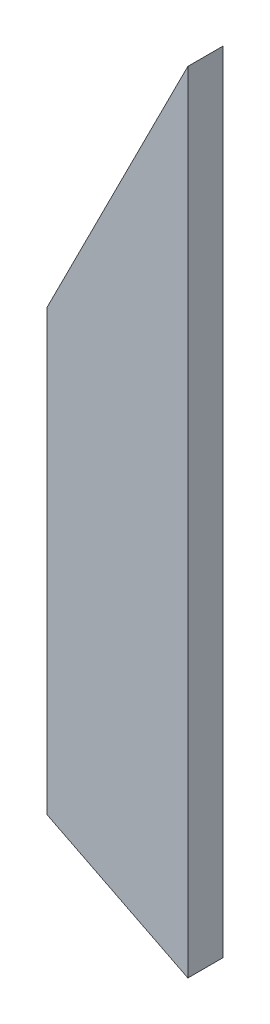
ISO-10303-21;
HEADER;
FILE_DESCRIPTION(('STEP AP214'),'2;1');
FILE_NAME('part.step','',(''),(''),'','','');
FILE_SCHEMA(('AUTOMOTIVE_DESIGN { 1 0 10303 214 1 1 1 1 }'));
ENDSEC;
DATA;
#1=APPLICATION_CONTEXT('core data for automotive mechanical design processes');
#2=APPLICATION_PROTOCOL_DEFINITION('international standard','automotive_design',2000,#1);
#3=PRODUCT_CONTEXT('',#1,'mechanical');
#4=PRODUCT('Part','Part','',(#3));
#5=PRODUCT_RELATED_PRODUCT_CATEGORY('part','',(#4));
#6=PRODUCT_DEFINITION_FORMATION('','',#4);
#7=PRODUCT_DEFINITION_CONTEXT('part definition',#1,'design');
#8=PRODUCT_DEFINITION('design','',#6,#7);
#9=PRODUCT_DEFINITION_SHAPE('','',#8);
#10=(LENGTH_UNIT() NAMED_UNIT(*) SI_UNIT(.MILLI.,.METRE.));
#11=(NAMED_UNIT(*) PLANE_ANGLE_UNIT() SI_UNIT($,.RADIAN.));
#12=(NAMED_UNIT(*) SI_UNIT($,.STERADIAN.) SOLID_ANGLE_UNIT());
#13=UNCERTAINTY_MEASURE_WITH_UNIT(LENGTH_MEASURE(1.E-05),#10,'distance_accuracy_value','');
#14=(GEOMETRIC_REPRESENTATION_CONTEXT(3) GLOBAL_UNCERTAINTY_ASSIGNED_CONTEXT((#13)) GLOBAL_UNIT_ASSIGNED_CONTEXT((#10,
#11,#12)) REPRESENTATION_CONTEXT('',''));
#15=CARTESIAN_POINT('',(0.,0.,0.));
#16=DIRECTION('',(0.,0.,1.));
#17=DIRECTION('',(1.,0.,0.));
#18=AXIS2_PLACEMENT_3D('',#15,#16,#17);
#19=CARTESIAN_POINT('',(-52.0419054555334,-103.179789113261,12.7));
#20=DIRECTION('',(-0.450340007604232,-0.892857142857143,0.));
#21=DIRECTION('',(0.892857142857143,-0.450340007604232,0.));
#22=AXIS2_PLACEMENT_3D('',#19,#20,#21);
#23=PLANE('',#22);
#24=DIRECTION('',(-0.892857142857143,0.450340007604232,0.));
#25=VECTOR('',#24,1.);
#26=CARTESIAN_POINT('',(-52.0419054555334,-103.179789113261,0.));
#27=LINE('',#26,#25);
#28=CARTESIAN_POINT('',(25.4,-142.24,0.));
#29=VERTEX_POINT('',#28);
#30=CARTESIAN_POINT('',(-25.4,-116.61745492735,0.));
#31=VERTEX_POINT('',#30);
#32=EDGE_CURVE('E110',#29,#31,#27,.T.);
#33=ORIENTED_EDGE('',*,*,#32,.F.);
#34=DIRECTION('',(0.,0.,-1.));
#35=VECTOR('',#34,1.);
#36=CARTESIAN_POINT('',(25.4,-142.24,12.7));
#37=LINE('',#36,#35);
#38=CARTESIAN_POINT('',(25.4,-142.24,12.7));
#39=VERTEX_POINT('',#38);
#40=EDGE_CURVE('E11',#39,#29,#37,.T.);
#41=ORIENTED_EDGE('',*,*,#40,.F.);
#42=DIRECTION('',(-0.892857142857143,0.450340007604232,0.));
#43=VECTOR('',#42,1.);
#44=CARTESIAN_POINT('',(-52.0419054555334,-103.179789113261,12.7));
#45=LINE('',#44,#43);
#46=CARTESIAN_POINT('',(-25.4,-116.61745492735,12.7));
#47=VERTEX_POINT('',#46);
#48=EDGE_CURVE('E101',#39,#47,#45,.T.);
#49=ORIENTED_EDGE('',*,*,#48,.T.);
#50=DIRECTION('',(0.,0.,-1.));
#51=VECTOR('',#50,1.);
#52=CARTESIAN_POINT('',(-25.4,-116.61745492735,12.7));
#53=LINE('',#52,#51);
#54=EDGE_CURVE('E80',#47,#31,#53,.T.);
#55=ORIENTED_EDGE('',*,*,#54,.T.);
#56=EDGE_LOOP('',(#33,#41,#49,#55));
#57=FACE_BOUND('',#56,.T.);
#58=ADVANCED_FACE('F41',(#57),#23,.T.);
#59=CARTESIAN_POINT('',(25.4,0.,12.7));
#60=DIRECTION('',(1.,0.,0.));
#61=DIRECTION('',(0.,1.,0.));
#62=AXIS2_PLACEMENT_3D('',#59,#60,#61);
#63=PLANE('',#62);
#64=DIRECTION('',(0.,-1.,0.));
#65=VECTOR('',#64,1.);
#66=CARTESIAN_POINT('',(25.4,0.,0.));
#67=LINE('',#66,#65);
#68=CARTESIAN_POINT('',(25.4,142.24,0.));
#69=VERTEX_POINT('',#68);
#70=EDGE_CURVE('E93',#69,#29,#67,.T.);
#71=ORIENTED_EDGE('',*,*,#70,.F.);
#72=DIRECTION('',(0.,0.,-1.));
#73=VECTOR('',#72,1.);
#74=CARTESIAN_POINT('',(25.4,142.24,12.7));
#75=LINE('',#74,#73);
#76=CARTESIAN_POINT('',(25.4,142.24,12.7));
#77=VERTEX_POINT('',#76);
#78=EDGE_CURVE('E50',#77,#69,#75,.T.);
#79=ORIENTED_EDGE('',*,*,#78,.F.);
#80=DIRECTION('',(0.,-1.,0.));
#81=VECTOR('',#80,1.);
#82=CARTESIAN_POINT('',(25.4,0.,12.7));
#83=LINE('',#82,#81);
#84=EDGE_CURVE('E91',#77,#39,#83,.T.);
#85=ORIENTED_EDGE('',*,*,#84,.T.);
#86=ORIENTED_EDGE('',*,*,#40,.T.);
#87=EDGE_LOOP('',(#71,#79,#85,#86));
#88=FACE_BOUND('',#87,.T.);
#89=ADVANCED_FACE('F89',(#88),#63,.T.);
#90=CARTESIAN_POINT('',(-36.9574399583527,18.6463584570063,12.7));
#91=DIRECTION('',(0.892801429036147,-0.45045045045045,0.));
#92=DIRECTION('',(0.45045045045045,0.892801429036147,0.));
#93=AXIS2_PLACEMENT_3D('',#90,#91,#92);
#94=PLANE('',#93);
#95=DIRECTION('',(-0.45045045045045,-0.892801429036147,0.));
#96=VECTOR('',#95,1.);
#97=CARTESIAN_POINT('',(-36.9574399583527,18.6463584570063,0.));
#98=LINE('',#97,#96);
#99=CARTESIAN_POINT('',(-25.4,41.5534260390195,0.));
#100=VERTEX_POINT('',#99);
#101=EDGE_CURVE('E73',#69,#100,#98,.T.);
#102=ORIENTED_EDGE('',*,*,#101,.T.);
#103=DIRECTION('',(0.,0.,-1.));
#104=VECTOR('',#103,1.);
#105=CARTESIAN_POINT('',(-25.4,41.5534260390195,12.7));
#106=LINE('',#105,#104);
#107=CARTESIAN_POINT('',(-25.4,41.5534260390195,12.7));
#108=VERTEX_POINT('',#107);
#109=EDGE_CURVE('E95',#108,#100,#106,.T.);
#110=ORIENTED_EDGE('',*,*,#109,.F.);
#111=DIRECTION('',(-0.45045045045045,-0.892801429036147,0.));
#112=VECTOR('',#111,1.);
#113=CARTESIAN_POINT('',(-36.9574399583527,18.6463584570063,12.7));
#114=LINE('',#113,#112);
#115=EDGE_CURVE('E96',#77,#108,#114,.T.);
#116=ORIENTED_EDGE('',*,*,#115,.F.);
#117=ORIENTED_EDGE('',*,*,#78,.T.);
#118=EDGE_LOOP('',(#102,#110,#116,#117));
#119=FACE_BOUND('',#118,.T.);
#120=ADVANCED_FACE('F97',(#119),#94,.F.);
#121=CARTESIAN_POINT('',(-25.4,0.,12.7));
#122=DIRECTION('',(1.,0.,0.));
#123=DIRECTION('',(0.,1.,0.));
#124=AXIS2_PLACEMENT_3D('',#121,#122,#123);
#125=PLANE('',#124);
#126=DIRECTION('',(0.,-1.,0.));
#127=VECTOR('',#126,1.);
#128=CARTESIAN_POINT('',(-25.4,0.,0.));
#129=LINE('',#128,#127);
#130=EDGE_CURVE('E105',#100,#31,#129,.T.);
#131=ORIENTED_EDGE('',*,*,#130,.T.);
#132=ORIENTED_EDGE('',*,*,#54,.F.);
#133=DIRECTION('',(0.,-1.,0.));
#134=VECTOR('',#133,1.);
#135=CARTESIAN_POINT('',(-25.4,0.,12.7));
#136=LINE('',#135,#134);
#137=EDGE_CURVE('E58',#108,#47,#136,.T.);
#138=ORIENTED_EDGE('',*,*,#137,.F.);
#139=ORIENTED_EDGE('',*,*,#109,.T.);
#140=EDGE_LOOP('',(#131,#132,#138,#139));
#141=FACE_BOUND('',#140,.T.);
#142=ADVANCED_FACE('F125',(#141),#125,.F.);
#143=CARTESIAN_POINT('',(0.,0.,12.7));
#144=DIRECTION('',(0.,0.,1.));
#145=DIRECTION('',(1.,0.,0.));
#146=AXIS2_PLACEMENT_3D('',#143,#144,#145);
#147=PLANE('',#146);
#148=ORIENTED_EDGE('',*,*,#48,.F.);
#149=ORIENTED_EDGE('',*,*,#84,.F.);
#150=ORIENTED_EDGE('',*,*,#115,.T.);
#151=ORIENTED_EDGE('',*,*,#137,.T.);
#152=EDGE_LOOP('',(#148,#149,#150,#151));
#153=FACE_BOUND('',#152,.T.);
#154=ADVANCED_FACE('F100',(#153),#147,.T.);
#155=CARTESIAN_POINT('',(0.,0.,0.));
#156=DIRECTION('',(0.,0.,1.));
#157=DIRECTION('',(1.,0.,0.));
#158=AXIS2_PLACEMENT_3D('',#155,#156,#157);
#159=PLANE('',#158);
#160=ORIENTED_EDGE('',*,*,#32,.T.);
#161=ORIENTED_EDGE('',*,*,#130,.F.);
#162=ORIENTED_EDGE('',*,*,#101,.F.);
#163=ORIENTED_EDGE('',*,*,#70,.T.);
#164=EDGE_LOOP('',(#160,#161,#162,#163));
#165=FACE_BOUND('',#164,.T.);
#166=ADVANCED_FACE('F127',(#165),#159,.F.);
#167=CLOSED_SHELL('',(#58,#89,#120,#142,#154,#166));
#168=MANIFOLD_SOLID_BREP('B2',#167);
#169=ADVANCED_BREP_SHAPE_REPRESENTATION('',(#18,#168),#14);
#170=SHAPE_DEFINITION_REPRESENTATION(#9,#169);
ENDSEC;
END-ISO-10303-21;
